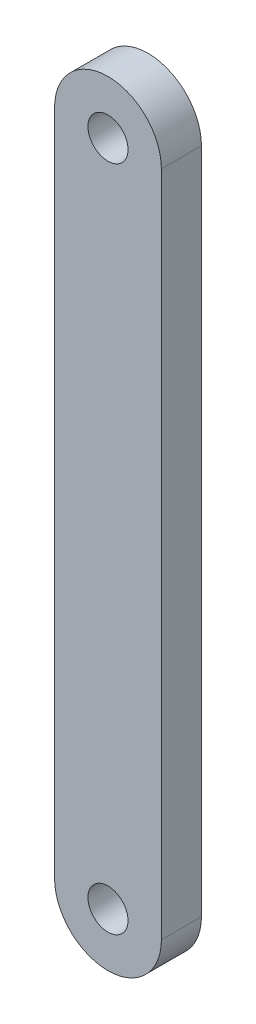
ISO-10303-21;
HEADER;
FILE_DESCRIPTION(('STEP AP214'),'2;1');
FILE_NAME('part.step','',(''),(''),'','','');
FILE_SCHEMA(('AUTOMOTIVE_DESIGN { 1 0 10303 214 1 1 1 1 }'));
ENDSEC;
DATA;
#1=APPLICATION_CONTEXT('core data for automotive mechanical design processes');
#2=APPLICATION_PROTOCOL_DEFINITION('international standard','automotive_design',2000,#1);
#3=PRODUCT_CONTEXT('',#1,'mechanical');
#4=PRODUCT('Part','Part','',(#3));
#5=PRODUCT_RELATED_PRODUCT_CATEGORY('part','',(#4));
#6=PRODUCT_DEFINITION_FORMATION('','',#4);
#7=PRODUCT_DEFINITION_CONTEXT('part definition',#1,'design');
#8=PRODUCT_DEFINITION('design','',#6,#7);
#9=PRODUCT_DEFINITION_SHAPE('','',#8);
#10=(LENGTH_UNIT() NAMED_UNIT(*) SI_UNIT(.MILLI.,.METRE.));
#11=(NAMED_UNIT(*) PLANE_ANGLE_UNIT() SI_UNIT($,.RADIAN.));
#12=(NAMED_UNIT(*) SI_UNIT($,.STERADIAN.) SOLID_ANGLE_UNIT());
#13=UNCERTAINTY_MEASURE_WITH_UNIT(LENGTH_MEASURE(1.E-05),#10,'distance_accuracy_value','');
#14=(GEOMETRIC_REPRESENTATION_CONTEXT(3) GLOBAL_UNCERTAINTY_ASSIGNED_CONTEXT((#13)) GLOBAL_UNIT_ASSIGNED_CONTEXT((#10,
#11,#12)) REPRESENTATION_CONTEXT('',''));
#15=CARTESIAN_POINT('',(0.,0.,0.));
#16=DIRECTION('',(0.,0.,1.));
#17=DIRECTION('',(1.,0.,0.));
#18=AXIS2_PLACEMENT_3D('',#15,#16,#17);
#19=CARTESIAN_POINT('',(0.,25.,3.));
#20=DIRECTION('',(0.,0.,1.));
#21=DIRECTION('',(1.,0.,0.));
#22=AXIS2_PLACEMENT_3D('',#19,#20,#21);
#23=PLANE('',#22);
#24=CARTESIAN_POINT('',(0.,-25.,3.));
#25=DIRECTION('',(0.,0.,1.));
#26=DIRECTION('',(1.,0.,0.));
#27=AXIS2_PLACEMENT_3D('',#24,#25,#26);
#28=CIRCLE('',#27,1.5);
#29=CARTESIAN_POINT('',(1.50000000000001,-25.,3.));
#30=VERTEX_POINT('',#29);
#31=EDGE_CURVE('E119',#30,#30,#28,.T.);
#32=ORIENTED_EDGE('',*,*,#31,.F.);
#33=EDGE_LOOP('',(#32));
#34=FACE_BOUND('',#33,.T.);
#35=CARTESIAN_POINT('',(0.,25.,3.));
#36=DIRECTION('',(0.,0.,1.));
#37=DIRECTION('',(1.,0.,0.));
#38=AXIS2_PLACEMENT_3D('',#35,#36,#37);
#39=CIRCLE('',#38,4.00000000000002);
#40=CARTESIAN_POINT('',(4.00000000000002,25.,3.));
#41=VERTEX_POINT('',#40);
#42=CARTESIAN_POINT('',(-4.00000000000001,25.,3.));
#43=VERTEX_POINT('',#42);
#44=EDGE_CURVE('E98',#41,#43,#39,.T.);
#45=ORIENTED_EDGE('',*,*,#44,.T.);
#46=DIRECTION('',(0.,-1.,0.));
#47=VECTOR('',#46,1.);
#48=CARTESIAN_POINT('',(-4.00000000000001,25.,3.));
#49=LINE('',#48,#47);
#50=CARTESIAN_POINT('',(-4.00000000000001,-25.,3.));
#51=VERTEX_POINT('',#50);
#52=EDGE_CURVE('E91',#43,#51,#49,.T.);
#53=ORIENTED_EDGE('',*,*,#52,.T.);
#54=CARTESIAN_POINT('',(0.,-25.,3.));
#55=DIRECTION('',(0.,0.,1.));
#56=DIRECTION('',(1.,0.,0.));
#57=AXIS2_PLACEMENT_3D('',#54,#55,#56);
#58=CIRCLE('',#57,4.00000000000002);
#59=CARTESIAN_POINT('',(4.00000000000002,-25.,3.));
#60=VERTEX_POINT('',#59);
#61=EDGE_CURVE('E96',#51,#60,#58,.T.);
#62=ORIENTED_EDGE('',*,*,#61,.T.);
#63=DIRECTION('',(0.,1.,0.));
#64=VECTOR('',#63,1.);
#65=CARTESIAN_POINT('',(4.00000000000002,25.,3.));
#66=LINE('',#65,#64);
#67=EDGE_CURVE('E64',#60,#41,#66,.T.);
#68=ORIENTED_EDGE('',*,*,#67,.T.);
#69=EDGE_LOOP('',(#45,#53,#62,#68));
#70=FACE_BOUND('',#69,.T.);
#71=CARTESIAN_POINT('',(0.,25.,3.));
#72=DIRECTION('',(0.,0.,1.));
#73=DIRECTION('',(1.,0.,0.));
#74=AXIS2_PLACEMENT_3D('',#71,#72,#73);
#75=CIRCLE('',#74,1.5);
#76=CARTESIAN_POINT('',(1.50000000000001,25.,3.));
#77=VERTEX_POINT('',#76);
#78=EDGE_CURVE('E140',#77,#77,#75,.T.);
#79=ORIENTED_EDGE('',*,*,#78,.F.);
#80=EDGE_LOOP('',(#79));
#81=FACE_BOUND('',#80,.T.);
#82=ADVANCED_FACE('F44',(#34,#70,#81),#23,.T.);
#83=CARTESIAN_POINT('',(0.,25.,0.));
#84=DIRECTION('',(0.,0.,1.));
#85=DIRECTION('',(1.,0.,0.));
#86=AXIS2_PLACEMENT_3D('',#83,#84,#85);
#87=PLANE('',#86);
#88=CARTESIAN_POINT('',(0.,25.,0.));
#89=DIRECTION('',(0.,0.,1.));
#90=DIRECTION('',(1.,0.,0.));
#91=AXIS2_PLACEMENT_3D('',#88,#89,#90);
#92=CIRCLE('',#91,4.00000000000002);
#93=CARTESIAN_POINT('',(4.00000000000002,25.,0.));
#94=VERTEX_POINT('',#93);
#95=CARTESIAN_POINT('',(-4.00000000000001,25.,0.));
#96=VERTEX_POINT('',#95);
#97=EDGE_CURVE('E111',#94,#96,#92,.T.);
#98=ORIENTED_EDGE('',*,*,#97,.F.);
#99=DIRECTION('',(0.,1.,0.));
#100=VECTOR('',#99,1.);
#101=CARTESIAN_POINT('',(4.00000000000002,25.,0.));
#102=LINE('',#101,#100);
#103=CARTESIAN_POINT('',(4.00000000000002,-25.,0.));
#104=VERTEX_POINT('',#103);
#105=EDGE_CURVE('E88',#104,#94,#102,.T.);
#106=ORIENTED_EDGE('',*,*,#105,.F.);
#107=CARTESIAN_POINT('',(0.,-25.,0.));
#108=DIRECTION('',(0.,0.,1.));
#109=DIRECTION('',(1.,0.,0.));
#110=AXIS2_PLACEMENT_3D('',#107,#108,#109);
#111=CIRCLE('',#110,4.00000000000002);
#112=CARTESIAN_POINT('',(-4.00000000000001,-25.,0.));
#113=VERTEX_POINT('',#112);
#114=EDGE_CURVE('E78',#113,#104,#111,.T.);
#115=ORIENTED_EDGE('',*,*,#114,.F.);
#116=DIRECTION('',(0.,-1.,0.));
#117=VECTOR('',#116,1.);
#118=CARTESIAN_POINT('',(-4.00000000000001,25.,0.));
#119=LINE('',#118,#117);
#120=EDGE_CURVE('E103',#96,#113,#119,.T.);
#121=ORIENTED_EDGE('',*,*,#120,.F.);
#122=EDGE_LOOP('',(#98,#106,#115,#121));
#123=FACE_BOUND('',#122,.T.);
#124=CARTESIAN_POINT('',(0.,-25.,0.));
#125=DIRECTION('',(0.,0.,1.));
#126=DIRECTION('',(1.,0.,0.));
#127=AXIS2_PLACEMENT_3D('',#124,#125,#126);
#128=CIRCLE('',#127,1.5);
#129=CARTESIAN_POINT('',(1.50000000000001,-25.,0.));
#130=VERTEX_POINT('',#129);
#131=EDGE_CURVE('E136',#130,#130,#128,.T.);
#132=ORIENTED_EDGE('',*,*,#131,.T.);
#133=EDGE_LOOP('',(#132));
#134=FACE_BOUND('',#133,.T.);
#135=CARTESIAN_POINT('',(0.,25.,0.));
#136=DIRECTION('',(0.,0.,1.));
#137=DIRECTION('',(1.,0.,0.));
#138=AXIS2_PLACEMENT_3D('',#135,#136,#137);
#139=CIRCLE('',#138,1.5);
#140=CARTESIAN_POINT('',(1.50000000000001,25.,0.));
#141=VERTEX_POINT('',#140);
#142=EDGE_CURVE('E145',#141,#141,#139,.T.);
#143=ORIENTED_EDGE('',*,*,#142,.T.);
#144=EDGE_LOOP('',(#143));
#145=FACE_BOUND('',#144,.T.);
#146=ADVANCED_FACE('F132',(#123,#134,#145),#87,.F.);
#147=CARTESIAN_POINT('',(0.,25.,3.));
#148=DIRECTION('',(0.,0.,-1.));
#149=DIRECTION('',(-1.,0.,0.));
#150=AXIS2_PLACEMENT_3D('',#147,#148,#149);
#151=CYLINDRICAL_SURFACE('',#150,4.00000000000002);
#152=ORIENTED_EDGE('',*,*,#97,.T.);
#153=DIRECTION('',(0.,0.,-1.));
#154=VECTOR('',#153,1.);
#155=CARTESIAN_POINT('',(-4.00000000000001,25.,3.));
#156=LINE('',#155,#154);
#157=EDGE_CURVE('E11',#43,#96,#156,.T.);
#158=ORIENTED_EDGE('',*,*,#157,.F.);
#159=ORIENTED_EDGE('',*,*,#44,.F.);
#160=DIRECTION('',(0.,0.,-1.));
#161=VECTOR('',#160,1.);
#162=CARTESIAN_POINT('',(4.00000000000002,25.,3.));
#163=LINE('',#162,#161);
#164=EDGE_CURVE('E109',#41,#94,#163,.T.);
#165=ORIENTED_EDGE('',*,*,#164,.T.);
#166=EDGE_LOOP('',(#152,#158,#159,#165));
#167=FACE_BOUND('',#166,.T.);
#168=ADVANCED_FACE('F50',(#167),#151,.T.);
#169=CARTESIAN_POINT('',(-4.00000000000001,25.,3.));
#170=DIRECTION('',(1.,0.,0.));
#171=DIRECTION('',(0.,0.,-1.));
#172=AXIS2_PLACEMENT_3D('',#169,#170,#171);
#173=PLANE('',#172);
#174=ORIENTED_EDGE('',*,*,#120,.T.);
#175=DIRECTION('',(0.,0.,-1.));
#176=VECTOR('',#175,1.);
#177=CARTESIAN_POINT('',(-4.00000000000001,-25.,3.));
#178=LINE('',#177,#176);
#179=EDGE_CURVE('E54',#51,#113,#178,.T.);
#180=ORIENTED_EDGE('',*,*,#179,.F.);
#181=ORIENTED_EDGE('',*,*,#52,.F.);
#182=ORIENTED_EDGE('',*,*,#157,.T.);
#183=EDGE_LOOP('',(#174,#180,#181,#182));
#184=FACE_BOUND('',#183,.T.);
#185=ADVANCED_FACE('F105',(#184),#173,.F.);
#186=CARTESIAN_POINT('',(0.,-25.,3.));
#187=DIRECTION('',(0.,0.,-1.));
#188=DIRECTION('',(-1.,0.,0.));
#189=AXIS2_PLACEMENT_3D('',#186,#187,#188);
#190=CYLINDRICAL_SURFACE('',#189,4.00000000000002);
#191=ORIENTED_EDGE('',*,*,#114,.T.);
#192=DIRECTION('',(0.,0.,-1.));
#193=VECTOR('',#192,1.);
#194=CARTESIAN_POINT('',(4.00000000000002,-25.,3.));
#195=LINE('',#194,#193);
#196=EDGE_CURVE('E104',#60,#104,#195,.T.);
#197=ORIENTED_EDGE('',*,*,#196,.F.);
#198=ORIENTED_EDGE('',*,*,#61,.F.);
#199=ORIENTED_EDGE('',*,*,#179,.T.);
#200=EDGE_LOOP('',(#191,#197,#198,#199));
#201=FACE_BOUND('',#200,.T.);
#202=ADVANCED_FACE('F106',(#201),#190,.T.);
#203=CARTESIAN_POINT('',(4.00000000000002,25.,3.));
#204=DIRECTION('',(-1.,0.,0.));
#205=DIRECTION('',(0.,0.,1.));
#206=AXIS2_PLACEMENT_3D('',#203,#204,#205);
#207=PLANE('',#206);
#208=ORIENTED_EDGE('',*,*,#105,.T.);
#209=ORIENTED_EDGE('',*,*,#164,.F.);
#210=ORIENTED_EDGE('',*,*,#67,.F.);
#211=ORIENTED_EDGE('',*,*,#196,.T.);
#212=EDGE_LOOP('',(#208,#209,#210,#211));
#213=FACE_BOUND('',#212,.T.);
#214=ADVANCED_FACE('F126',(#213),#207,.F.);
#215=CARTESIAN_POINT('',(0.,-25.,3.));
#216=DIRECTION('',(0.,0.,-1.));
#217=DIRECTION('',(-1.,0.,0.));
#218=AXIS2_PLACEMENT_3D('',#215,#216,#217);
#219=CYLINDRICAL_SURFACE('',#218,1.5);
#220=ORIENTED_EDGE('',*,*,#31,.T.);
#221=EDGE_LOOP('',(#220));
#222=FACE_BOUND('',#221,.T.);
#223=ORIENTED_EDGE('',*,*,#131,.F.);
#224=EDGE_LOOP('',(#223));
#225=FACE_BOUND('',#224,.T.);
#226=ADVANCED_FACE('F162',(#222,#225),#219,.F.);
#227=CARTESIAN_POINT('',(0.,25.,3.));
#228=DIRECTION('',(0.,0.,-1.));
#229=DIRECTION('',(-1.,0.,0.));
#230=AXIS2_PLACEMENT_3D('',#227,#228,#229);
#231=CYLINDRICAL_SURFACE('',#230,1.5);
#232=ORIENTED_EDGE('',*,*,#78,.T.);
#233=EDGE_LOOP('',(#232));
#234=FACE_BOUND('',#233,.T.);
#235=ORIENTED_EDGE('',*,*,#142,.F.);
#236=EDGE_LOOP('',(#235));
#237=FACE_BOUND('',#236,.T.);
#238=ADVANCED_FACE('F155',(#234,#237),#231,.F.);
#239=CLOSED_SHELL('',(#82,#146,#168,#185,#202,#214,#226,#238));
#240=MANIFOLD_SOLID_BREP('B2',#239);
#241=ADVANCED_BREP_SHAPE_REPRESENTATION('',(#18,#240),#14);
#242=SHAPE_DEFINITION_REPRESENTATION(#9,#241);
ENDSEC;
END-ISO-10303-21;
